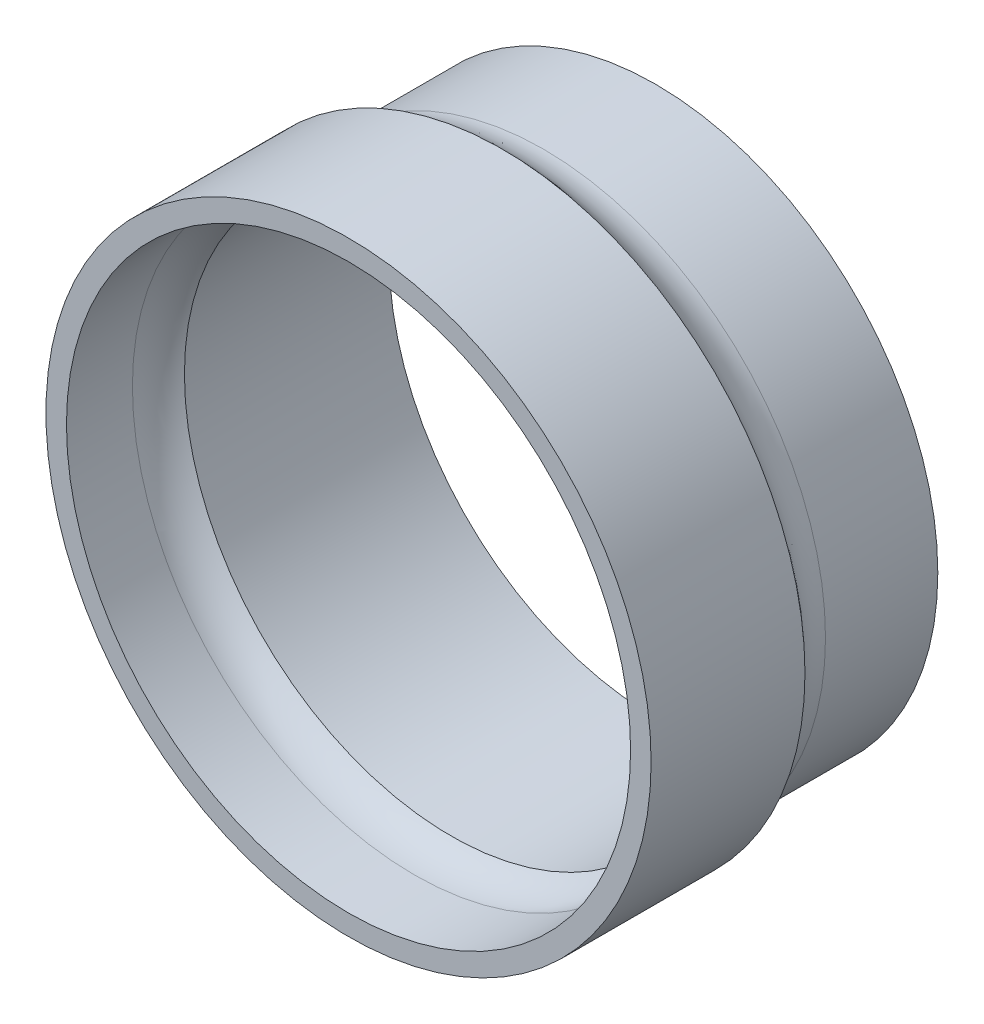
ISO-10303-21;
HEADER;
FILE_DESCRIPTION(('STEP AP214'),'2;1');
FILE_NAME('part.step','',(''),(''),'','','');
FILE_SCHEMA(('AUTOMOTIVE_DESIGN { 1 0 10303 214 1 1 1 1 }'));
ENDSEC;
DATA;
#1=APPLICATION_CONTEXT('core data for automotive mechanical design processes');
#2=APPLICATION_PROTOCOL_DEFINITION('international standard','automotive_design',2000,#1);
#3=PRODUCT_CONTEXT('',#1,'mechanical');
#4=PRODUCT('Part','Part','',(#3));
#5=PRODUCT_RELATED_PRODUCT_CATEGORY('part','',(#4));
#6=PRODUCT_DEFINITION_FORMATION('','',#4);
#7=PRODUCT_DEFINITION_CONTEXT('part definition',#1,'design');
#8=PRODUCT_DEFINITION('design','',#6,#7);
#9=PRODUCT_DEFINITION_SHAPE('','',#8);
#10=(LENGTH_UNIT() NAMED_UNIT(*) SI_UNIT(.MILLI.,.METRE.));
#11=(NAMED_UNIT(*) PLANE_ANGLE_UNIT() SI_UNIT($,.RADIAN.));
#12=(NAMED_UNIT(*) SI_UNIT($,.STERADIAN.) SOLID_ANGLE_UNIT());
#13=UNCERTAINTY_MEASURE_WITH_UNIT(LENGTH_MEASURE(1.E-05),#10,'distance_accuracy_value','');
#14=(GEOMETRIC_REPRESENTATION_CONTEXT(3) GLOBAL_UNCERTAINTY_ASSIGNED_CONTEXT((#13)) GLOBAL_UNIT_ASSIGNED_CONTEXT((#10,
#11,#12)) REPRESENTATION_CONTEXT('',''));
#15=CARTESIAN_POINT('',(0.,0.,0.));
#16=DIRECTION('',(0.,0.,1.));
#17=DIRECTION('',(1.,0.,0.));
#18=AXIS2_PLACEMENT_3D('',#15,#16,#17);
#19=CARTESIAN_POINT('',(0.,0.,39.9));
#20=DIRECTION('',(0.,0.,-1.));
#21=DIRECTION('',(-1.,0.,0.));
#22=AXIS2_PLACEMENT_3D('',#19,#20,#21);
#23=CYLINDRICAL_SURFACE('',#22,55.);
#24=CARTESIAN_POINT('',(0.,0.,21.9));
#25=DIRECTION('',(0.,0.,1.));
#26=DIRECTION('',(1.,0.,0.));
#27=AXIS2_PLACEMENT_3D('',#24,#25,#26);
#28=CIRCLE('',#27,55.);
#29=CARTESIAN_POINT('',(55.,0.,21.9));
#30=VERTEX_POINT('',#29);
#31=EDGE_CURVE('E49',#30,#30,#28,.F.);
#32=ORIENTED_EDGE('',*,*,#31,.T.);
#33=EDGE_LOOP('',(#32));
#34=FACE_BOUND('',#33,.T.);
#35=CARTESIAN_POINT('',(0.,0.,0.));
#36=DIRECTION('',(0.,0.,1.));
#37=DIRECTION('',(1.,0.,0.));
#38=AXIS2_PLACEMENT_3D('',#35,#36,#37);
#39=CIRCLE('',#38,55.);
#40=CARTESIAN_POINT('',(55.,0.,0.));
#41=VERTEX_POINT('',#40);
#42=EDGE_CURVE('E57',#41,#41,#39,.T.);
#43=ORIENTED_EDGE('',*,*,#42,.T.);
#44=EDGE_LOOP('',(#43));
#45=FACE_BOUND('',#44,.T.);
#46=ADVANCED_FACE('F42',(#34,#45),#23,.T.);
#47=CARTESIAN_POINT('',(0.,0.,0.));
#48=DIRECTION('',(0.,0.,1.));
#49=DIRECTION('',(1.,0.,0.));
#50=AXIS2_PLACEMENT_3D('',#47,#48,#49);
#51=PLANE('',#50);
#52=ORIENTED_EDGE('',*,*,#42,.F.);
#53=EDGE_LOOP('',(#52));
#54=FACE_BOUND('',#53,.T.);
#55=CARTESIAN_POINT('',(0.,0.,0.));
#56=DIRECTION('',(0.,0.,1.));
#57=DIRECTION('',(1.,0.,0.));
#58=AXIS2_PLACEMENT_3D('',#55,#56,#57);
#59=CIRCLE('',#58,52.);
#60=CARTESIAN_POINT('',(52.,0.,0.));
#61=VERTEX_POINT('',#60);
#62=EDGE_CURVE('E62',#61,#61,#59,.T.);
#63=ORIENTED_EDGE('',*,*,#62,.T.);
#64=EDGE_LOOP('',(#63));
#65=FACE_BOUND('',#64,.T.);
#66=ADVANCED_FACE('F89',(#54,#65),#51,.F.);
#67=CARTESIAN_POINT('',(0.,0.,-20.1));
#68=DIRECTION('',(0.,0.,1.));
#69=DIRECTION('',(1.,0.,0.));
#70=AXIS2_PLACEMENT_3D('',#67,#68,#69);
#71=CYLINDRICAL_SURFACE('',#70,52.);
#72=CARTESIAN_POINT('',(0.,0.,39.9));
#73=DIRECTION('',(0.,0.,1.));
#74=DIRECTION('',(1.,0.,0.));
#75=AXIS2_PLACEMENT_3D('',#72,#73,#74);
#76=CIRCLE('',#75,52.);
#77=CARTESIAN_POINT('',(52.,0.,39.9));
#78=VERTEX_POINT('',#77);
#79=EDGE_CURVE('E53',#78,#78,#76,.T.);
#80=CARTESIAN_POINT('',(52.,0.,39.9));
#81=CARTESIAN_POINT('',(52.,0.,39.484375));
#82=CARTESIAN_POINT('',(52.,0.,39.06875));
#83=CARTESIAN_POINT('',(52.,0.,38.2375));
#84=CARTESIAN_POINT('',(52.,0.,37.821875));
#85=CARTESIAN_POINT('',(52.,0.,36.990625));
#86=CARTESIAN_POINT('',(52.,0.,36.575));
#87=CARTESIAN_POINT('',(52.,0.,35.74375));
#88=CARTESIAN_POINT('',(52.,0.,35.328125));
#89=CARTESIAN_POINT('',(52.,0.,34.496875));
#90=CARTESIAN_POINT('',(52.,0.,34.08125));
#91=CARTESIAN_POINT('',(52.,0.,33.25));
#92=CARTESIAN_POINT('',(52.,0.,32.834375));
#93=CARTESIAN_POINT('',(52.,0.,32.003125));
#94=CARTESIAN_POINT('',(52.,0.,31.5875));
#95=CARTESIAN_POINT('',(52.,0.,30.75625));
#96=CARTESIAN_POINT('',(52.,0.,30.340625));
#97=CARTESIAN_POINT('',(52.,0.,29.509375));
#98=CARTESIAN_POINT('',(52.,0.,29.09375));
#99=CARTESIAN_POINT('',(52.,0.,28.2625));
#100=CARTESIAN_POINT('',(52.,0.,27.846875));
#101=CARTESIAN_POINT('',(52.,0.,27.015625));
#102=CARTESIAN_POINT('',(52.,0.,26.6));
#103=CARTESIAN_POINT('',(52.,0.,25.76875));
#104=CARTESIAN_POINT('',(52.,0.,25.353125));
#105=CARTESIAN_POINT('',(52.,0.,24.521875));
#106=CARTESIAN_POINT('',(52.,0.,24.10625));
#107=CARTESIAN_POINT('',(52.,0.,23.275));
#108=CARTESIAN_POINT('',(52.,0.,22.859375));
#109=CARTESIAN_POINT('',(52.,0.,22.028125));
#110=CARTESIAN_POINT('',(52.,0.,21.6125));
#111=CARTESIAN_POINT('',(52.,0.,20.78125));
#112=CARTESIAN_POINT('',(52.,0.,20.365625));
#113=CARTESIAN_POINT('',(52.,0.,19.534375));
#114=CARTESIAN_POINT('',(52.,0.,19.11875));
#115=CARTESIAN_POINT('',(52.,0.,18.2875));
#116=CARTESIAN_POINT('',(52.,0.,17.871875));
#117=CARTESIAN_POINT('',(52.,0.,17.040625));
#118=CARTESIAN_POINT('',(52.,0.,16.625));
#119=CARTESIAN_POINT('',(52.,0.,15.79375));
#120=CARTESIAN_POINT('',(52.,0.,15.378125));
#121=CARTESIAN_POINT('',(52.,0.,14.546875));
#122=CARTESIAN_POINT('',(52.,0.,14.13125));
#123=CARTESIAN_POINT('',(52.,0.,13.3));
#124=CARTESIAN_POINT('',(52.,0.,12.884375));
#125=CARTESIAN_POINT('',(52.,0.,12.053125));
#126=CARTESIAN_POINT('',(52.,0.,11.6375));
#127=CARTESIAN_POINT('',(52.,0.,10.80625));
#128=CARTESIAN_POINT('',(52.,0.,10.390625));
#129=CARTESIAN_POINT('',(52.,0.,9.559375));
#130=CARTESIAN_POINT('',(52.,0.,9.14375));
#131=CARTESIAN_POINT('',(52.,0.,8.3125));
#132=CARTESIAN_POINT('',(52.,0.,7.896875));
#133=CARTESIAN_POINT('',(52.,0.,7.065625));
#134=CARTESIAN_POINT('',(52.,0.,6.65));
#135=CARTESIAN_POINT('',(52.,0.,5.81875));
#136=CARTESIAN_POINT('',(52.,0.,5.403125));
#137=CARTESIAN_POINT('',(52.,0.,4.571875));
#138=CARTESIAN_POINT('',(52.,0.,4.15624999999999));
#139=CARTESIAN_POINT('',(52.,0.,3.325));
#140=CARTESIAN_POINT('',(52.,0.,2.909375));
#141=CARTESIAN_POINT('',(52.,0.,2.078125));
#142=CARTESIAN_POINT('',(52.,0.,1.6625));
#143=CARTESIAN_POINT('',(52.,0.,0.831249999999998));
#144=CARTESIAN_POINT('',(52.,0.,0.415624999999997));
#145=CARTESIAN_POINT('',(52.,0.,0.));
#146=B_SPLINE_CURVE_WITH_KNOTS('',3,(#80,#81,#82,#83,#84,#85,#86,#87,#88,#89,#90,#91,#92,#93,
#94,#95,#96,#97,#98,#99,#100,#101,#102,#103,#104,#105,#106,#107,#108,#109,#110,#111,#112,#113,
#114,#115,#116,#117,#118,#119,#120,#121,#122,#123,#124,#125,#126,#127,#128,#129,#130,#131,#132,
#133,#134,#135,#136,#137,#138,#139,#140,#141,#142,#143,#144,#145),.UNSPECIFIED.,.F.,.F.,(4,2,2,
2,2,2,2,2,2,2,2,2,2,2,2,2,2,2,2,2,2,2,2,2,2,2,2,2,2,2,2,2,4),(0.,1.246875,2.49375,3.740625,
4.9875,6.234375,7.48125,8.728125,9.975,11.221875,12.46875,13.715625,14.9625,16.209375,17.45625,
18.703125,19.95,21.196875,22.44375,23.690625,24.9375,26.184375,27.43125,28.678125,29.925,
31.171875,32.41875,33.665625,34.9125,36.159375,37.40625,38.653125,39.9),.UNSPECIFIED.);
#147=EDGE_CURVE('BSEAM80',#78,#61,#146,.T.);
#148=ORIENTED_EDGE('',*,*,#79,.T.);
#149=ORIENTED_EDGE('',*,*,#62,.F.);
#150=ORIENTED_EDGE('',*,*,#147,.T.);
#151=ORIENTED_EDGE('',*,*,#147,.F.);
#152=EDGE_LOOP('',(#148,#150,#149,#151));
#153=FACE_BOUND('',#152,.T.);
#154=ADVANCED_FACE('F80',(#153),#71,.F.);
#155=CARTESIAN_POINT('',(0.,0.,59.9));
#156=DIRECTION('',(0.,0.,1.));
#157=DIRECTION('',(1.,0.,0.));
#158=AXIS2_PLACEMENT_3D('',#155,#156,#157);
#159=PLANE('',#158);
#160=CARTESIAN_POINT('',(0.,0.,59.9));
#161=DIRECTION('',(0.,0.,1.));
#162=DIRECTION('',(1.,0.,0.));
#163=AXIS2_PLACEMENT_3D('',#160,#161,#162);
#164=CIRCLE('',#163,59.);
#165=CARTESIAN_POINT('',(59.,0.,59.9));
#166=VERTEX_POINT('',#165);
#167=EDGE_CURVE('E65',#166,#166,#164,.T.);
#168=ORIENTED_EDGE('',*,*,#167,.T.);
#169=EDGE_LOOP('',(#168));
#170=FACE_BOUND('',#169,.T.);
#171=CARTESIAN_POINT('',(0.,0.,59.9));
#172=DIRECTION('',(0.,0.,1.));
#173=DIRECTION('',(1.,0.,0.));
#174=AXIS2_PLACEMENT_3D('',#171,#172,#173);
#175=CIRCLE('',#174,55.);
#176=CARTESIAN_POINT('',(55.,0.,59.9));
#177=VERTEX_POINT('',#176);
#178=EDGE_CURVE('E69',#177,#177,#175,.T.);
#179=ORIENTED_EDGE('',*,*,#178,.F.);
#180=EDGE_LOOP('',(#179));
#181=FACE_BOUND('',#180,.T.);
#182=ADVANCED_FACE('F77',(#170,#181),#159,.T.);
#183=CARTESIAN_POINT('',(0.,0.,59.9));
#184=DIRECTION('',(0.,0.,-1.));
#185=DIRECTION('',(-1.,0.,0.));
#186=AXIS2_PLACEMENT_3D('',#183,#184,#185);
#187=CYLINDRICAL_SURFACE('',#186,59.);
#188=ORIENTED_EDGE('',*,*,#167,.F.);
#189=EDGE_LOOP('',(#188));
#190=FACE_BOUND('',#189,.T.);
#191=CARTESIAN_POINT('',(0.,0.,29.9));
#192=DIRECTION('',(0.,0.,1.));
#193=DIRECTION('',(1.,0.,0.));
#194=AXIS2_PLACEMENT_3D('',#191,#192,#193);
#195=CIRCLE('',#194,59.);
#196=CARTESIAN_POINT('',(59.,0.,29.9));
#197=VERTEX_POINT('',#196);
#198=EDGE_CURVE('E66',#197,#197,#195,.T.);
#199=ORIENTED_EDGE('',*,*,#198,.T.);
#200=EDGE_LOOP('',(#199));
#201=FACE_BOUND('',#200,.T.);
#202=ADVANCED_FACE('F79',(#190,#201),#187,.T.);
#203=CARTESIAN_POINT('',(0.,0.,59.9));
#204=DIRECTION('',(0.,0.,-1.));
#205=DIRECTION('',(-1.,0.,0.));
#206=AXIS2_PLACEMENT_3D('',#203,#204,#205);
#207=CYLINDRICAL_SURFACE('',#206,55.);
#208=CARTESIAN_POINT('',(0.,0.,47.0414284285428));
#209=DIRECTION('',(0.,0.,-1.));
#210=DIRECTION('',(-1.,0.,0.));
#211=AXIS2_PLACEMENT_3D('',#208,#209,#210);
#212=CIRCLE('',#211,55.);
#213=CARTESIAN_POINT('',(-55.,0.,47.0414284285428));
#214=VERTEX_POINT('',#213);
#215=EDGE_CURVE('E11',#214,#214,#212,.T.);
#216=ORIENTED_EDGE('',*,*,#215,.T.);
#217=EDGE_LOOP('',(#216));
#218=FACE_BOUND('',#217,.T.);
#219=ORIENTED_EDGE('',*,*,#178,.T.);
#220=EDGE_LOOP('',(#219));
#221=FACE_BOUND('',#220,.T.);
#222=ADVANCED_FACE('F75',(#218,#221),#207,.F.);
#223=CARTESIAN_POINT('',(0.,0.,21.9));
#224=DIRECTION('',(0.,0.,1.));
#225=DIRECTION('',(1.,0.,0.));
#226=AXIS2_PLACEMENT_3D('',#223,#224,#225);
#227=TOROIDAL_SURFACE('',#226,65.,10.);
#228=ORIENTED_EDGE('',*,*,#31,.F.);
#229=EDGE_LOOP('',(#228));
#230=FACE_BOUND('',#229,.T.);
#231=ORIENTED_EDGE('',*,*,#198,.F.);
#232=EDGE_LOOP('',(#231));
#233=FACE_BOUND('',#232,.T.);
#234=ADVANCED_FACE('F100',(#230,#233),#227,.F.);
#235=CARTESIAN_POINT('',(0.,0.,47.0414284285428));
#236=DIRECTION('',(0.,0.,-1.));
#237=DIRECTION('',(-1.,0.,0.));
#238=AXIS2_PLACEMENT_3D('',#235,#236,#237);
#239=TOROIDAL_SURFACE('',#238,45.,10.);
#240=ORIENTED_EDGE('',*,*,#79,.F.);
#241=EDGE_LOOP('',(#240));
#242=FACE_BOUND('',#241,.T.);
#243=ORIENTED_EDGE('',*,*,#215,.F.);
#244=EDGE_LOOP('',(#243));
#245=FACE_BOUND('',#244,.T.);
#246=ADVANCED_FACE('F44',(#242,#245),#239,.F.);
#247=CLOSED_SHELL('',(#46,#66,#154,#182,#202,#222,#234,#246));
#248=MANIFOLD_SOLID_BREP('B2',#247);
#249=ADVANCED_BREP_SHAPE_REPRESENTATION('',(#18,#248),#14);
#250=SHAPE_DEFINITION_REPRESENTATION(#9,#249);
ENDSEC;
END-ISO-10303-21;
